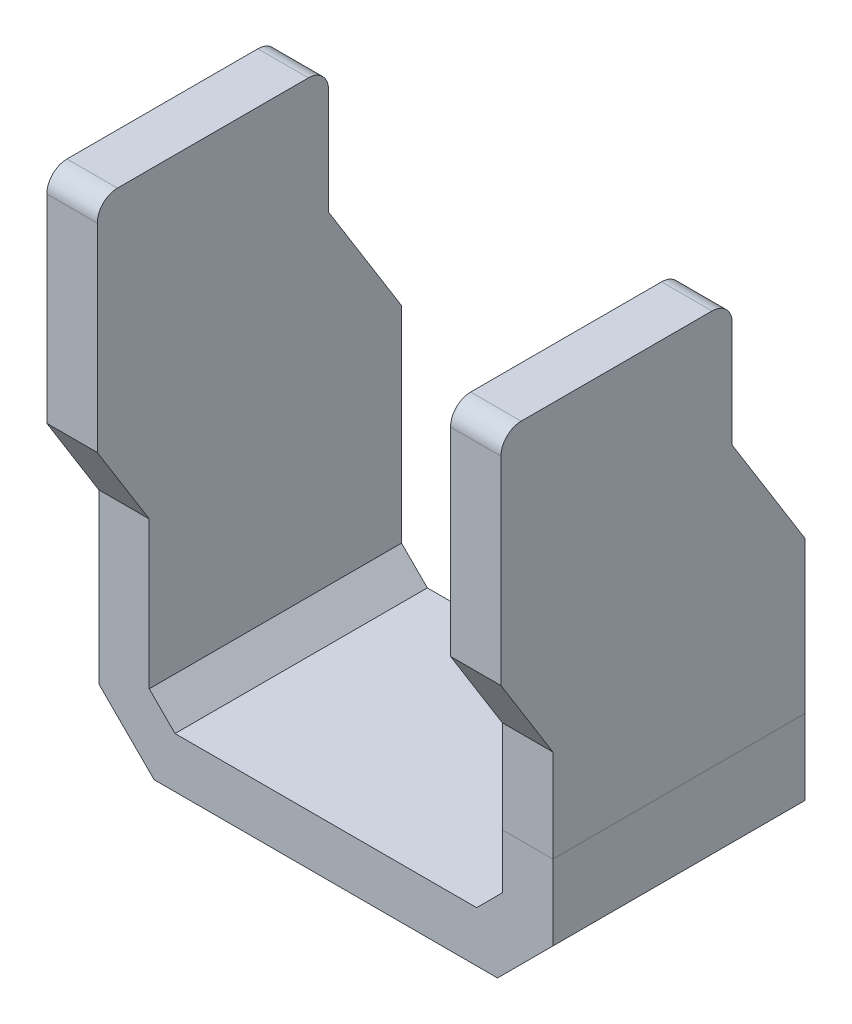
ISO-10303-21;
HEADER;
FILE_DESCRIPTION(('STEP AP214'),'2;1');
FILE_NAME('part.step','',(''),(''),'','','');
FILE_SCHEMA(('AUTOMOTIVE_DESIGN { 1 0 10303 214 1 1 1 1 }'));
ENDSEC;
DATA;
#1=APPLICATION_CONTEXT('core data for automotive mechanical design processes');
#2=APPLICATION_PROTOCOL_DEFINITION('international standard','automotive_design',2000,#1);
#3=PRODUCT_CONTEXT('',#1,'mechanical');
#4=PRODUCT('Part','Part','',(#3));
#5=PRODUCT_RELATED_PRODUCT_CATEGORY('part','',(#4));
#6=PRODUCT_DEFINITION_FORMATION('','',#4);
#7=PRODUCT_DEFINITION_CONTEXT('part definition',#1,'design');
#8=PRODUCT_DEFINITION('design','',#6,#7);
#9=PRODUCT_DEFINITION_SHAPE('','',#8);
#10=(LENGTH_UNIT() NAMED_UNIT(*) SI_UNIT(.MILLI.,.METRE.));
#11=(NAMED_UNIT(*) PLANE_ANGLE_UNIT() SI_UNIT($,.RADIAN.));
#12=(NAMED_UNIT(*) SI_UNIT($,.STERADIAN.) SOLID_ANGLE_UNIT());
#13=UNCERTAINTY_MEASURE_WITH_UNIT(LENGTH_MEASURE(1.E-05),#10,'distance_accuracy_value','');
#14=(GEOMETRIC_REPRESENTATION_CONTEXT(3) GLOBAL_UNCERTAINTY_ASSIGNED_CONTEXT((#13)) GLOBAL_UNIT_ASSIGNED_CONTEXT((#10,
#11,#12)) REPRESENTATION_CONTEXT('',''));
#15=CARTESIAN_POINT('',(0.,0.,0.));
#16=DIRECTION('',(0.,0.,1.));
#17=DIRECTION('',(1.,0.,0.));
#18=AXIS2_PLACEMENT_3D('',#15,#16,#17);
#19=CARTESIAN_POINT('',(-31.9130325338588,17.1366638319386,25.));
#20=DIRECTION('',(0.,0.,1.));
#21=DIRECTION('',(1.,0.,0.));
#22=AXIS2_PLACEMENT_3D('',#19,#20,#21);
#23=PLANE('',#22);
#24=DIRECTION('',(0.,1.,0.));
#25=VECTOR('',#24,1.);
#26=CARTESIAN_POINT('',(17.5,17.1366638319386,25.));
#27=LINE('',#26,#25);
#28=CARTESIAN_POINT('',(17.5,7.94957947348261,25.));
#29=VERTEX_POINT('',#28);
#30=CARTESIAN_POINT('',(17.5,17.1366638319386,25.));
#31=VERTEX_POINT('',#30);
#32=EDGE_CURVE('E59',#29,#31,#27,.T.);
#33=ORIENTED_EDGE('',*,*,#32,.F.);
#34=DIRECTION('',(1.,0.,0.));
#35=VECTOR('',#34,1.);
#36=CARTESIAN_POINT('',(-31.9130325338588,7.9495794734826,25.));
#37=LINE('',#36,#35);
#38=CARTESIAN_POINT('',(22.5,7.94957947348261,25.));
#39=VERTEX_POINT('',#38);
#40=EDGE_CURVE('E123',#29,#39,#37,.T.);
#41=ORIENTED_EDGE('',*,*,#40,.T.);
#42=DIRECTION('',(0.,-1.,0.));
#43=VECTOR('',#42,1.);
#44=CARTESIAN_POINT('',(22.5,17.1366638319386,25.));
#45=LINE('',#44,#43);
#46=CARTESIAN_POINT('',(22.5,17.1366638319386,25.));
#47=VERTEX_POINT('',#46);
#48=EDGE_CURVE('E130',#47,#39,#45,.T.);
#49=ORIENTED_EDGE('',*,*,#48,.F.);
#50=DIRECTION('',(1.,0.,0.));
#51=VECTOR('',#50,1.);
#52=CARTESIAN_POINT('',(-31.9130325338588,17.1366638319386,25.));
#53=LINE('',#52,#51);
#54=EDGE_CURVE('E167',#31,#47,#53,.T.);
#55=ORIENTED_EDGE('',*,*,#54,.F.);
#56=EDGE_LOOP('',(#33,#41,#49,#55));
#57=FACE_BOUND('',#56,.T.);
#58=ADVANCED_FACE('F51',(#57),#23,.T.);
#59=CARTESIAN_POINT('',(-31.9130325338588,25.4161805973599,30.1485773049447));
#60=DIRECTION('',(0.,-0.528071025982883,0.849200206969703));
#61=DIRECTION('',(0.,-0.849200206969703,-0.528071025982883));
#62=AXIS2_PLACEMENT_3D('',#59,#60,#61);
#63=PLANE('',#62);
#64=DIRECTION('',(0.,0.849200206969703,0.528071025982883));
#65=VECTOR('',#64,1.);
#66=CARTESIAN_POINT('',(17.5,25.4161805973599,30.1485773049447));
#67=LINE('',#66,#65);
#68=CARTESIAN_POINT('',(17.5,25.4161805973599,30.1485773049447));
#69=VERTEX_POINT('',#68);
#70=EDGE_CURVE('E224',#31,#69,#67,.T.);
#71=ORIENTED_EDGE('',*,*,#70,.F.);
#72=ORIENTED_EDGE('',*,*,#54,.T.);
#73=DIRECTION('',(0.,-0.849200206969702,-0.528071025982883));
#74=VECTOR('',#73,1.);
#75=CARTESIAN_POINT('',(22.5,25.4161805973599,30.1485773049447));
#76=LINE('',#75,#74);
#77=CARTESIAN_POINT('',(22.5,25.4161805973599,30.1485773049447));
#78=VERTEX_POINT('',#77);
#79=EDGE_CURVE('E135',#78,#47,#76,.T.);
#80=ORIENTED_EDGE('',*,*,#79,.F.);
#81=DIRECTION('',(1.,0.,0.));
#82=VECTOR('',#81,1.);
#83=CARTESIAN_POINT('',(-31.9130325338588,25.4161805973599,30.1485773049447));
#84=LINE('',#83,#82);
#85=EDGE_CURVE('E173',#69,#78,#84,.T.);
#86=ORIENTED_EDGE('',*,*,#85,.F.);
#87=EDGE_LOOP('',(#71,#72,#80,#86));
#88=FACE_BOUND('',#87,.T.);
#89=ADVANCED_FACE('F223',(#88),#63,.T.);
#90=CARTESIAN_POINT('',(-31.9130325338588,45.0994335048831,30.1485773049447));
#91=DIRECTION('',(0.,0.,1.));
#92=DIRECTION('',(1.,0.,0.));
#93=AXIS2_PLACEMENT_3D('',#90,#91,#92);
#94=PLANE('',#93);
#95=DIRECTION('',(0.,1.,0.));
#96=VECTOR('',#95,1.);
#97=CARTESIAN_POINT('',(17.5,45.0994335048831,30.1485773049447));
#98=LINE('',#97,#96);
#99=CARTESIAN_POINT('',(17.5,45.0994335048831,30.1485773049447));
#100=VERTEX_POINT('',#99);
#101=EDGE_CURVE('E216',#69,#100,#98,.T.);
#102=ORIENTED_EDGE('',*,*,#101,.F.);
#103=ORIENTED_EDGE('',*,*,#85,.T.);
#104=DIRECTION('',(0.,-1.,0.));
#105=VECTOR('',#104,1.);
#106=CARTESIAN_POINT('',(22.5,45.0994335048831,30.1485773049447));
#107=LINE('',#106,#105);
#108=CARTESIAN_POINT('',(22.5,45.0994335048831,30.1485773049447));
#109=VERTEX_POINT('',#108);
#110=EDGE_CURVE('E170',#109,#78,#107,.T.);
#111=ORIENTED_EDGE('',*,*,#110,.F.);
#112=DIRECTION('',(1.,0.,0.));
#113=VECTOR('',#112,1.);
#114=CARTESIAN_POINT('',(-31.9130325338588,45.0994335048831,30.1485773049447));
#115=LINE('',#114,#113);
#116=EDGE_CURVE('E174',#100,#109,#115,.T.);
#117=ORIENTED_EDGE('',*,*,#116,.F.);
#118=EDGE_LOOP('',(#102,#103,#111,#117));
#119=FACE_BOUND('',#118,.T.);
#120=ADVANCED_FACE('F217',(#119),#94,.T.);
#121=CARTESIAN_POINT('',(-31.9130325338588,45.0994335048831,28.1485773049447));
#122=DIRECTION('',(1.,0.,0.));
#123=DIRECTION('',(0.,1.,0.));
#124=AXIS2_PLACEMENT_3D('',#121,#122,#123);
#125=CYLINDRICAL_SURFACE('',#124,2.);
#126=CARTESIAN_POINT('',(17.5,45.0994335048831,28.1485773049447));
#127=DIRECTION('',(1.,0.,0.));
#128=DIRECTION('',(0.,0.,-1.));
#129=AXIS2_PLACEMENT_3D('',#126,#127,#128);
#130=CIRCLE('',#129,2.);
#131=CARTESIAN_POINT('',(17.5,47.0994335048831,28.1485773049447));
#132=VERTEX_POINT('',#131);
#133=EDGE_CURVE('E211',#100,#132,#130,.F.);
#134=ORIENTED_EDGE('',*,*,#133,.F.);
#135=ORIENTED_EDGE('',*,*,#116,.T.);
#136=CARTESIAN_POINT('',(22.5,45.0994335048831,28.1485773049447));
#137=DIRECTION('',(1.,0.,0.));
#138=DIRECTION('',(0.,1.,0.));
#139=AXIS2_PLACEMENT_3D('',#136,#137,#138);
#140=CIRCLE('',#139,2.);
#141=CARTESIAN_POINT('',(22.5,47.0994335048831,28.1485773049447));
#142=VERTEX_POINT('',#141);
#143=EDGE_CURVE('E165',#142,#109,#140,.T.);
#144=ORIENTED_EDGE('',*,*,#143,.F.);
#145=DIRECTION('',(1.,0.,0.));
#146=VECTOR('',#145,1.);
#147=CARTESIAN_POINT('',(-31.9130325338588,47.0994335048831,28.1485773049447));
#148=LINE('',#147,#146);
#149=EDGE_CURVE('E180',#132,#142,#148,.T.);
#150=ORIENTED_EDGE('',*,*,#149,.F.);
#151=EDGE_LOOP('',(#134,#135,#144,#150));
#152=FACE_BOUND('',#151,.T.);
#153=ADVANCED_FACE('F212',(#152),#125,.T.);
#154=CARTESIAN_POINT('',(-31.9130325338588,47.0994335048831,9.23077803607524));
#155=DIRECTION('',(0.,1.,0.));
#156=DIRECTION('',(0.,0.,1.));
#157=AXIS2_PLACEMENT_3D('',#154,#155,#156);
#158=PLANE('',#157);
#159=DIRECTION('',(0.,0.,-1.));
#160=VECTOR('',#159,1.);
#161=CARTESIAN_POINT('',(17.5,47.0994335048831,9.23077803607524));
#162=LINE('',#161,#160);
#163=CARTESIAN_POINT('',(17.5,47.0994335048831,9.23077803607524));
#164=VERTEX_POINT('',#163);
#165=EDGE_CURVE('E226',#132,#164,#162,.T.);
#166=ORIENTED_EDGE('',*,*,#165,.F.);
#167=ORIENTED_EDGE('',*,*,#149,.T.);
#168=DIRECTION('',(0.,0.,1.));
#169=VECTOR('',#168,1.);
#170=CARTESIAN_POINT('',(22.5,47.0994335048831,9.23077803607524));
#171=LINE('',#170,#169);
#172=CARTESIAN_POINT('',(22.5,47.0994335048831,9.23077803607524));
#173=VERTEX_POINT('',#172);
#174=EDGE_CURVE('E163',#173,#142,#171,.T.);
#175=ORIENTED_EDGE('',*,*,#174,.F.);
#176=DIRECTION('',(1.,0.,0.));
#177=VECTOR('',#176,1.);
#178=CARTESIAN_POINT('',(-31.9130325338588,47.0994335048831,9.23077803607524));
#179=LINE('',#178,#177);
#180=EDGE_CURVE('E177',#164,#173,#179,.T.);
#181=ORIENTED_EDGE('',*,*,#180,.F.);
#182=EDGE_LOOP('',(#166,#167,#175,#181));
#183=FACE_BOUND('',#182,.T.);
#184=ADVANCED_FACE('F210',(#183),#158,.T.);
#185=CARTESIAN_POINT('',(-31.9130325338588,45.0994335048831,9.23077803607524));
#186=DIRECTION('',(1.,0.,0.));
#187=DIRECTION('',(0.,1.,0.));
#188=AXIS2_PLACEMENT_3D('',#185,#186,#187);
#189=CYLINDRICAL_SURFACE('',#188,2.);
#190=CARTESIAN_POINT('',(17.5,45.0994335048831,9.23077803607524));
#191=DIRECTION('',(1.,0.,0.));
#192=DIRECTION('',(0.,0.,-1.));
#193=AXIS2_PLACEMENT_3D('',#190,#191,#192);
#194=CIRCLE('',#193,2.);
#195=CARTESIAN_POINT('',(17.5,45.0994335048831,7.23077803607524));
#196=VERTEX_POINT('',#195);
#197=EDGE_CURVE('E204',#164,#196,#194,.F.);
#198=ORIENTED_EDGE('',*,*,#197,.F.);
#199=ORIENTED_EDGE('',*,*,#180,.T.);
#200=CARTESIAN_POINT('',(22.5,45.0994335048831,9.23077803607524));
#201=DIRECTION('',(1.,0.,0.));
#202=DIRECTION('',(0.,1.,0.));
#203=AXIS2_PLACEMENT_3D('',#200,#201,#202);
#204=CIRCLE('',#203,2.);
#205=CARTESIAN_POINT('',(22.5,45.0994335048831,7.23077803607524));
#206=VERTEX_POINT('',#205);
#207=EDGE_CURVE('E158',#206,#173,#204,.T.);
#208=ORIENTED_EDGE('',*,*,#207,.F.);
#209=DIRECTION('',(1.,0.,0.));
#210=VECTOR('',#209,1.);
#211=CARTESIAN_POINT('',(-31.9130325338588,45.0994335048831,7.23077803607524));
#212=LINE('',#211,#210);
#213=EDGE_CURVE('E181',#196,#206,#212,.T.);
#214=ORIENTED_EDGE('',*,*,#213,.F.);
#215=EDGE_LOOP('',(#198,#199,#208,#214));
#216=FACE_BOUND('',#215,.T.);
#217=ADVANCED_FACE('F202',(#216),#189,.T.);
#218=CARTESIAN_POINT('',(-31.9130325338588,45.0994335048831,7.23077803607524));
#219=DIRECTION('',(0.,0.,-1.));
#220=DIRECTION('',(-1.,0.,0.));
#221=AXIS2_PLACEMENT_3D('',#218,#219,#220);
#222=PLANE('',#221);
#223=DIRECTION('',(0.,-1.,0.));
#224=VECTOR('',#223,1.);
#225=CARTESIAN_POINT('',(17.5,45.0994335048831,7.23077803607524));
#226=LINE('',#225,#224);
#227=CARTESIAN_POINT('',(17.5,34.5775194714368,7.23077803607525));
#228=VERTEX_POINT('',#227);
#229=EDGE_CURVE('E66',#196,#228,#226,.T.);
#230=ORIENTED_EDGE('',*,*,#229,.F.);
#231=ORIENTED_EDGE('',*,*,#213,.T.);
#232=DIRECTION('',(0.,1.,0.));
#233=VECTOR('',#232,1.);
#234=CARTESIAN_POINT('',(22.5,45.0994335048831,7.23077803607524));
#235=LINE('',#234,#233);
#236=CARTESIAN_POINT('',(22.5,34.5775194714368,7.23077803607524));
#237=VERTEX_POINT('',#236);
#238=EDGE_CURVE('E151',#237,#206,#235,.T.);
#239=ORIENTED_EDGE('',*,*,#238,.F.);
#240=DIRECTION('',(1.,0.,0.));
#241=VECTOR('',#240,1.);
#242=CARTESIAN_POINT('',(-31.9130325338588,34.5775194714368,7.23077803607524));
#243=LINE('',#242,#241);
#244=EDGE_CURVE('E182',#228,#237,#243,.T.);
#245=ORIENTED_EDGE('',*,*,#244,.F.);
#246=EDGE_LOOP('',(#230,#231,#239,#245));
#247=FACE_BOUND('',#246,.T.);
#248=ADVANCED_FACE('F199',(#247),#222,.T.);
#249=CARTESIAN_POINT('',(-31.9130325338588,34.5775194714368,7.23077803607524));
#250=DIRECTION('',(0.,0.528071025982883,-0.849200206969702));
#251=DIRECTION('',(0.,0.849200206969702,0.528071025982883));
#252=AXIS2_PLACEMENT_3D('',#249,#250,#251);
#253=PLANE('',#252);
#254=DIRECTION('',(0.,-0.849200206969702,-0.528071025982883));
#255=VECTOR('',#254,1.);
#256=CARTESIAN_POINT('',(17.5,34.5775194714368,7.23077803607524));
#257=LINE('',#256,#255);
#258=CARTESIAN_POINT('',(17.5,22.9495794734826,0.));
#259=VERTEX_POINT('',#258);
#260=EDGE_CURVE('E61',#228,#259,#257,.T.);
#261=ORIENTED_EDGE('',*,*,#260,.F.);
#262=ORIENTED_EDGE('',*,*,#244,.T.);
#263=DIRECTION('',(0.,0.849200206969702,0.528071025982883));
#264=VECTOR('',#263,1.);
#265=CARTESIAN_POINT('',(22.5,34.5775194714368,7.23077803607524));
#266=LINE('',#265,#264);
#267=CARTESIAN_POINT('',(22.5,22.9495794734826,0.));
#268=VERTEX_POINT('',#267);
#269=EDGE_CURVE('E154',#268,#237,#266,.T.);
#270=ORIENTED_EDGE('',*,*,#269,.F.);
#271=DIRECTION('',(1.,0.,0.));
#272=VECTOR('',#271,1.);
#273=CARTESIAN_POINT('',(-31.9130325338588,22.9495794734826,0.));
#274=LINE('',#273,#272);
#275=EDGE_CURVE('E184',#259,#268,#274,.T.);
#276=ORIENTED_EDGE('',*,*,#275,.F.);
#277=EDGE_LOOP('',(#261,#262,#270,#276));
#278=FACE_BOUND('',#277,.T.);
#279=ADVANCED_FACE('F194',(#278),#253,.T.);
#280=CARTESIAN_POINT('',(-31.9130325338588,7.9495794734826,0.));
#281=DIRECTION('',(0.,0.,-1.));
#282=DIRECTION('',(-1.,0.,0.));
#283=AXIS2_PLACEMENT_3D('',#280,#281,#282);
#284=PLANE('',#283);
#285=DIRECTION('',(0.,-1.,0.));
#286=VECTOR('',#285,1.);
#287=CARTESIAN_POINT('',(17.5,7.9495794734826,0.));
#288=LINE('',#287,#286);
#289=CARTESIAN_POINT('',(17.5,7.94957947348261,0.));
#290=VERTEX_POINT('',#289);
#291=EDGE_CURVE('E175',#259,#290,#288,.T.);
#292=ORIENTED_EDGE('',*,*,#291,.F.);
#293=ORIENTED_EDGE('',*,*,#275,.T.);
#294=DIRECTION('',(0.,1.,0.));
#295=VECTOR('',#294,1.);
#296=CARTESIAN_POINT('',(22.5,7.94957947348261,0.));
#297=LINE('',#296,#295);
#298=CARTESIAN_POINT('',(22.5,7.94957947348261,0.));
#299=VERTEX_POINT('',#298);
#300=EDGE_CURVE('E145',#299,#268,#297,.T.);
#301=ORIENTED_EDGE('',*,*,#300,.F.);
#302=DIRECTION('',(1.,0.,0.));
#303=VECTOR('',#302,1.);
#304=CARTESIAN_POINT('',(-31.9130325338588,7.9495794734826,0.));
#305=LINE('',#304,#303);
#306=EDGE_CURVE('E132',#290,#299,#305,.T.);
#307=ORIENTED_EDGE('',*,*,#306,.F.);
#308=EDGE_LOOP('',(#292,#293,#301,#307));
#309=FACE_BOUND('',#308,.T.);
#310=ADVANCED_FACE('F188',(#309),#284,.T.);
#311=CARTESIAN_POINT('',(-31.9130325338588,7.9495794734826,25.));
#312=DIRECTION('',(0.,-1.,0.));
#313=DIRECTION('',(1.,0.,0.));
#314=AXIS2_PLACEMENT_3D('',#311,#312,#313);
#315=PLANE('',#314);
#316=DIRECTION('',(0.,0.,1.));
#317=VECTOR('',#316,1.);
#318=CARTESIAN_POINT('',(17.5,7.94957947348261,25.));
#319=LINE('',#318,#317);
#320=EDGE_CURVE('E12',#290,#29,#319,.T.);
#321=ORIENTED_EDGE('',*,*,#320,.F.);
#322=ORIENTED_EDGE('',*,*,#306,.T.);
#323=DIRECTION('',(0.,0.,-1.));
#324=VECTOR('',#323,1.);
#325=CARTESIAN_POINT('',(22.5,7.94957947348261,25.));
#326=LINE('',#325,#324);
#327=EDGE_CURVE('E137',#39,#299,#326,.T.);
#328=ORIENTED_EDGE('',*,*,#327,.F.);
#329=ORIENTED_EDGE('',*,*,#40,.F.);
#330=EDGE_LOOP('',(#321,#322,#328,#329));
#331=FACE_BOUND('',#330,.T.);
#332=ADVANCED_FACE('F140',(#331),#315,.T.);
#333=CARTESIAN_POINT('',(22.5,45.0994335048831,9.23077803607524));
#334=DIRECTION('',(1.,0.,0.));
#335=DIRECTION('',(0.,1.,0.));
#336=AXIS2_PLACEMENT_3D('',#333,#334,#335);
#337=PLANE('',#336);
#338=ORIENTED_EDGE('',*,*,#48,.T.);
#339=ORIENTED_EDGE('',*,*,#327,.T.);
#340=ORIENTED_EDGE('',*,*,#300,.T.);
#341=ORIENTED_EDGE('',*,*,#269,.T.);
#342=ORIENTED_EDGE('',*,*,#238,.T.);
#343=ORIENTED_EDGE('',*,*,#207,.T.);
#344=ORIENTED_EDGE('',*,*,#174,.T.);
#345=ORIENTED_EDGE('',*,*,#143,.T.);
#346=ORIENTED_EDGE('',*,*,#110,.T.);
#347=ORIENTED_EDGE('',*,*,#79,.T.);
#348=EDGE_LOOP('',(#338,#339,#340,#341,#342,#343,#344,#345,#346,#347));
#349=FACE_BOUND('',#348,.T.);
#350=ADVANCED_FACE('F144',(#349),#337,.T.);
#351=CARTESIAN_POINT('',(17.5,7.9495794734826,25.));
#352=DIRECTION('',(1.,0.,0.));
#353=DIRECTION('',(0.,0.,-1.));
#354=AXIS2_PLACEMENT_3D('',#351,#352,#353);
#355=PLANE('',#354);
#356=ORIENTED_EDGE('',*,*,#32,.T.);
#357=ORIENTED_EDGE('',*,*,#70,.T.);
#358=ORIENTED_EDGE('',*,*,#101,.T.);
#359=ORIENTED_EDGE('',*,*,#133,.T.);
#360=ORIENTED_EDGE('',*,*,#165,.T.);
#361=ORIENTED_EDGE('',*,*,#197,.T.);
#362=ORIENTED_EDGE('',*,*,#229,.T.);
#363=ORIENTED_EDGE('',*,*,#260,.T.);
#364=ORIENTED_EDGE('',*,*,#291,.T.);
#365=ORIENTED_EDGE('',*,*,#320,.T.);
#366=EDGE_LOOP('',(#356,#357,#358,#359,#360,#361,#362,#363,#364,#365));
#367=FACE_BOUND('',#366,.T.);
#368=ADVANCED_FACE('F231',(#367),#355,.F.);
#369=CLOSED_SHELL('',(#58,#89,#120,#153,#184,#217,#248,#279,#310,#332,#350,#368));
#370=MANIFOLD_SOLID_BREP('B2',#369);
#371=CARTESIAN_POINT('',(-22.5,7.9495794734826,25.));
#372=DIRECTION('',(1.,0.,0.));
#373=DIRECTION('',(0.,0.,-1.));
#374=AXIS2_PLACEMENT_3D('',#371,#372,#373);
#375=PLANE('',#374);
#376=DIRECTION('',(0.,-1.,0.));
#377=VECTOR('',#376,1.);
#378=CARTESIAN_POINT('',(-22.5,7.9495794734826,0.));
#379=LINE('',#378,#377);
#380=CARTESIAN_POINT('',(-22.5,22.9495794734826,0.));
#381=VERTEX_POINT('',#380);
#382=CARTESIAN_POINT('',(-22.5,0.488226466973244,0.));
#383=VERTEX_POINT('',#382);
#384=EDGE_CURVE('E444',#381,#383,#379,.T.);
#385=ORIENTED_EDGE('',*,*,#384,.T.);
#386=DIRECTION('',(0.,0.,-1.));
#387=VECTOR('',#386,1.);
#388=CARTESIAN_POINT('',(-22.5,0.488226466973244,25.));
#389=LINE('',#388,#387);
#390=CARTESIAN_POINT('',(-22.5,0.488226466973244,25.));
#391=VERTEX_POINT('',#390);
#392=EDGE_CURVE('E47',#391,#383,#389,.T.);
#393=ORIENTED_EDGE('',*,*,#392,.F.);
#394=DIRECTION('',(0.,-1.,0.));
#395=VECTOR('',#394,1.);
#396=CARTESIAN_POINT('',(-22.5,7.9495794734826,25.));
#397=LINE('',#396,#395);
#398=CARTESIAN_POINT('',(-22.5,17.1366638319386,25.));
#399=VERTEX_POINT('',#398);
#400=EDGE_CURVE('E397',#399,#391,#397,.T.);
#401=ORIENTED_EDGE('',*,*,#400,.F.);
#402=DIRECTION('',(0.,-0.849200206969702,-0.528071025982883));
#403=VECTOR('',#402,1.);
#404=CARTESIAN_POINT('',(-22.5,25.4161805973599,30.1485773049447));
#405=LINE('',#404,#403);
#406=CARTESIAN_POINT('',(-22.5,25.4161805973599,30.1485773049447));
#407=VERTEX_POINT('',#406);
#408=EDGE_CURVE('E580',#407,#399,#405,.T.);
#409=ORIENTED_EDGE('',*,*,#408,.F.);
#410=DIRECTION('',(0.,-1.,0.));
#411=VECTOR('',#410,1.);
#412=CARTESIAN_POINT('',(-22.5,45.0994335048831,30.1485773049447));
#413=LINE('',#412,#411);
#414=CARTESIAN_POINT('',(-22.5,45.0994335048831,30.1485773049447));
#415=VERTEX_POINT('',#414);
#416=EDGE_CURVE('E568',#415,#407,#413,.T.);
#417=ORIENTED_EDGE('',*,*,#416,.F.);
#418=CARTESIAN_POINT('',(-22.5,45.0994335048831,28.1485773049447));
#419=DIRECTION('',(1.,0.,0.));
#420=DIRECTION('',(0.,1.,0.));
#421=AXIS2_PLACEMENT_3D('',#418,#419,#420);
#422=CIRCLE('',#421,2.);
#423=CARTESIAN_POINT('',(-22.5,47.0994335048831,28.1485773049447));
#424=VERTEX_POINT('',#423);
#425=EDGE_CURVE('E559',#424,#415,#422,.T.);
#426=ORIENTED_EDGE('',*,*,#425,.F.);
#427=DIRECTION('',(0.,0.,1.));
#428=VECTOR('',#427,1.);
#429=CARTESIAN_POINT('',(-22.5,47.0994335048831,9.23077803607524));
#430=LINE('',#429,#428);
#431=CARTESIAN_POINT('',(-22.5,47.0994335048831,9.23077803607524));
#432=VERTEX_POINT('',#431);
#433=EDGE_CURVE('E546',#432,#424,#430,.T.);
#434=ORIENTED_EDGE('',*,*,#433,.F.);
#435=CARTESIAN_POINT('',(-22.5,45.0994335048831,9.23077803607524));
#436=DIRECTION('',(1.,0.,0.));
#437=DIRECTION('',(0.,1.,0.));
#438=AXIS2_PLACEMENT_3D('',#435,#436,#437);
#439=CIRCLE('',#438,2.);
#440=CARTESIAN_POINT('',(-22.5,45.0994335048831,7.23077803607524));
#441=VERTEX_POINT('',#440);
#442=EDGE_CURVE('E543',#441,#432,#439,.T.);
#443=ORIENTED_EDGE('',*,*,#442,.F.);
#444=DIRECTION('',(0.,1.,0.));
#445=VECTOR('',#444,1.);
#446=CARTESIAN_POINT('',(-22.5,45.0994335048831,7.23077803607524));
#447=LINE('',#446,#445);
#448=CARTESIAN_POINT('',(-22.5,34.5775194714368,7.23077803607524));
#449=VERTEX_POINT('',#448);
#450=EDGE_CURVE('E535',#449,#441,#447,.T.);
#451=ORIENTED_EDGE('',*,*,#450,.F.);
#452=DIRECTION('',(0.,0.849200206969702,0.528071025982883));
#453=VECTOR('',#452,1.);
#454=CARTESIAN_POINT('',(-22.5,34.5775194714368,7.23077803607524));
#455=LINE('',#454,#453);
#456=EDGE_CURVE('E522',#381,#449,#455,.T.);
#457=ORIENTED_EDGE('',*,*,#456,.F.);
#458=EDGE_LOOP('',(#385,#393,#401,#409,#417,#426,#434,#443,#451,#457));
#459=FACE_BOUND('',#458,.T.);
#460=ADVANCED_FACE('F332',(#459),#375,.F.);
#461=CARTESIAN_POINT('',(-22.5,0.488226466973244,25.));
#462=DIRECTION('',(0.707106781186549,0.707106781186546,0.));
#463=DIRECTION('',(-0.707106781186546,0.707106781186549,0.));
#464=AXIS2_PLACEMENT_3D('',#461,#462,#463);
#465=PLANE('',#464);
#466=DIRECTION('',(0.707106781186546,-0.707106781186549,0.));
#467=VECTOR('',#466,1.);
#468=CARTESIAN_POINT('',(-22.5,0.488226466973244,0.));
#469=LINE('',#468,#467);
#470=CARTESIAN_POINT('',(-17.0117735330268,-5.,0.));
#471=VERTEX_POINT('',#470);
#472=EDGE_CURVE('E450',#383,#471,#469,.T.);
#473=ORIENTED_EDGE('',*,*,#472,.T.);
#474=DIRECTION('',(0.,0.,-1.));
#475=VECTOR('',#474,1.);
#476=CARTESIAN_POINT('',(-17.0117735330268,-5.,25.));
#477=LINE('',#476,#475);
#478=CARTESIAN_POINT('',(-17.0117735330268,-5.,25.));
#479=VERTEX_POINT('',#478);
#480=EDGE_CURVE('E339',#479,#471,#477,.T.);
#481=ORIENTED_EDGE('',*,*,#480,.F.);
#482=DIRECTION('',(0.707106781186546,-0.707106781186549,0.));
#483=VECTOR('',#482,1.);
#484=CARTESIAN_POINT('',(-22.5,0.488226466973244,25.));
#485=LINE('',#484,#483);
#486=EDGE_CURVE('E493',#391,#479,#485,.T.);
#487=ORIENTED_EDGE('',*,*,#486,.F.);
#488=ORIENTED_EDGE('',*,*,#392,.T.);
#489=EDGE_LOOP('',(#473,#481,#487,#488));
#490=FACE_BOUND('',#489,.T.);
#491=ADVANCED_FACE('F489',(#490),#465,.F.);
#492=CARTESIAN_POINT('',(17.0117735330268,-4.99999999999999,25.));
#493=DIRECTION('',(0.,1.,0.));
#494=DIRECTION('',(-1.,0.,0.));
#495=AXIS2_PLACEMENT_3D('',#492,#493,#494);
#496=PLANE('',#495);
#497=DIRECTION('',(1.,0.,0.));
#498=VECTOR('',#497,1.);
#499=CARTESIAN_POINT('',(17.0117735330268,-4.99999999999999,0.));
#500=LINE('',#499,#498);
#501=CARTESIAN_POINT('',(17.0117735330268,-4.99999999999999,0.));
#502=VERTEX_POINT('',#501);
#503=EDGE_CURVE('E453',#471,#502,#500,.T.);
#504=ORIENTED_EDGE('',*,*,#503,.T.);
#505=DIRECTION('',(0.,0.,-1.));
#506=VECTOR('',#505,1.);
#507=CARTESIAN_POINT('',(17.0117735330268,-4.99999999999999,25.));
#508=LINE('',#507,#506);
#509=CARTESIAN_POINT('',(17.0117735330268,-4.99999999999999,25.));
#510=VERTEX_POINT('',#509);
#511=EDGE_CURVE('E480',#510,#502,#508,.T.);
#512=ORIENTED_EDGE('',*,*,#511,.F.);
#513=DIRECTION('',(1.,0.,0.));
#514=VECTOR('',#513,1.);
#515=CARTESIAN_POINT('',(-17.0117735330268,-5.,25.));
#516=LINE('',#515,#514);
#517=EDGE_CURVE('E487',#479,#510,#516,.T.);
#518=ORIENTED_EDGE('',*,*,#517,.F.);
#519=ORIENTED_EDGE('',*,*,#480,.T.);
#520=EDGE_LOOP('',(#504,#512,#518,#519));
#521=FACE_BOUND('',#520,.T.);
#522=ADVANCED_FACE('F481',(#521),#496,.F.);
#523=CARTESIAN_POINT('',(22.5,0.488226466973248,25.));
#524=DIRECTION('',(-0.707106781186549,0.707106781186546,0.));
#525=DIRECTION('',(-0.707106781186546,-0.707106781186549,0.));
#526=AXIS2_PLACEMENT_3D('',#523,#524,#525);
#527=PLANE('',#526);
#528=DIRECTION('',(0.707106781186546,0.707106781186549,0.));
#529=VECTOR('',#528,1.);
#530=CARTESIAN_POINT('',(22.5,0.488226466973248,0.));
#531=LINE('',#530,#529);
#532=CARTESIAN_POINT('',(22.5,0.488226466973248,0.));
#533=VERTEX_POINT('',#532);
#534=EDGE_CURVE('E452',#502,#533,#531,.T.);
#535=ORIENTED_EDGE('',*,*,#534,.T.);
#536=DIRECTION('',(0.,0.,-1.));
#537=VECTOR('',#536,1.);
#538=CARTESIAN_POINT('',(22.5,0.488226466973248,25.));
#539=LINE('',#538,#537);
#540=CARTESIAN_POINT('',(22.5,0.488226466973248,25.));
#541=VERTEX_POINT('',#540);
#542=EDGE_CURVE('E478',#541,#533,#539,.T.);
#543=ORIENTED_EDGE('',*,*,#542,.F.);
#544=DIRECTION('',(0.707106781186546,0.707106781186549,0.));
#545=VECTOR('',#544,1.);
#546=CARTESIAN_POINT('',(22.5,0.488226466973248,25.));
#547=LINE('',#546,#545);
#548=EDGE_CURVE('E514',#510,#541,#547,.T.);
#549=ORIENTED_EDGE('',*,*,#548,.F.);
#550=ORIENTED_EDGE('',*,*,#511,.T.);
#551=EDGE_LOOP('',(#535,#543,#549,#550));
#552=FACE_BOUND('',#551,.T.);
#553=ADVANCED_FACE('F502',(#552),#527,.F.);
#554=CARTESIAN_POINT('',(22.5,7.9495794734826,25.));
#555=DIRECTION('',(-1.,0.,0.));
#556=DIRECTION('',(0.,0.,1.));
#557=AXIS2_PLACEMENT_3D('',#554,#555,#556);
#558=PLANE('',#557);
#559=DIRECTION('',(0.,1.,0.));
#560=VECTOR('',#559,1.);
#561=CARTESIAN_POINT('',(22.5,7.9495794734826,0.));
#562=LINE('',#561,#560);
#563=CARTESIAN_POINT('',(22.5,7.9495794734826,0.));
#564=VERTEX_POINT('',#563);
#565=EDGE_CURVE('E451',#533,#564,#562,.T.);
#566=ORIENTED_EDGE('',*,*,#565,.T.);
#567=DIRECTION('',(0.,0.,-1.));
#568=VECTOR('',#567,1.);
#569=CARTESIAN_POINT('',(22.5,7.9495794734826,25.));
#570=LINE('',#569,#568);
#571=CARTESIAN_POINT('',(22.5,7.9495794734826,25.));
#572=VERTEX_POINT('',#571);
#573=EDGE_CURVE('E472',#572,#564,#570,.T.);
#574=ORIENTED_EDGE('',*,*,#573,.F.);
#575=DIRECTION('',(0.,1.,0.));
#576=VECTOR('',#575,1.);
#577=CARTESIAN_POINT('',(22.5,7.9495794734826,25.));
#578=LINE('',#577,#576);
#579=EDGE_CURVE('E509',#541,#572,#578,.T.);
#580=ORIENTED_EDGE('',*,*,#579,.F.);
#581=ORIENTED_EDGE('',*,*,#542,.T.);
#582=EDGE_LOOP('',(#566,#574,#580,#581));
#583=FACE_BOUND('',#582,.T.);
#584=ADVANCED_FACE('F507',(#583),#558,.F.);
#585=CARTESIAN_POINT('',(22.5,7.9495794734826,25.));
#586=DIRECTION('',(0.,-1.,0.));
#587=DIRECTION('',(1.,0.,0.));
#588=AXIS2_PLACEMENT_3D('',#585,#586,#587);
#589=PLANE('',#588);
#590=DIRECTION('',(-1.,0.,0.));
#591=VECTOR('',#590,1.);
#592=CARTESIAN_POINT('',(22.5,7.9495794734826,0.));
#593=LINE('',#592,#591);
#594=CARTESIAN_POINT('',(17.5,7.9495794734826,0.));
#595=VERTEX_POINT('',#594);
#596=EDGE_CURVE('E459',#564,#595,#593,.T.);
#597=ORIENTED_EDGE('',*,*,#596,.T.);
#598=DIRECTION('',(0.,0.,-1.));
#599=VECTOR('',#598,1.);
#600=CARTESIAN_POINT('',(17.5,7.9495794734826,25.));
#601=LINE('',#600,#599);
#602=CARTESIAN_POINT('',(17.5,7.9495794734826,25.));
#603=VERTEX_POINT('',#602);
#604=EDGE_CURVE('E468',#603,#595,#601,.T.);
#605=ORIENTED_EDGE('',*,*,#604,.F.);
#606=DIRECTION('',(-1.,0.,0.));
#607=VECTOR('',#606,1.);
#608=CARTESIAN_POINT('',(22.5,7.9495794734826,25.));
#609=LINE('',#608,#607);
#610=EDGE_CURVE('E515',#572,#603,#609,.T.);
#611=ORIENTED_EDGE('',*,*,#610,.F.);
#612=ORIENTED_EDGE('',*,*,#573,.T.);
#613=EDGE_LOOP('',(#597,#605,#611,#612));
#614=FACE_BOUND('',#613,.T.);
#615=ADVANCED_FACE('F668',(#614),#589,.F.);
#616=CARTESIAN_POINT('',(17.5,7.9495794734826,25.));
#617=DIRECTION('',(1.,0.,0.));
#618=DIRECTION('',(0.,0.,-1.));
#619=AXIS2_PLACEMENT_3D('',#616,#617,#618);
#620=PLANE('',#619);
#621=DIRECTION('',(0.,-1.,0.));
#622=VECTOR('',#621,1.);
#623=CARTESIAN_POINT('',(17.5,7.9495794734826,0.));
#624=LINE('',#623,#622);
#625=CARTESIAN_POINT('',(17.5,2.55929427883872,0.));
#626=VERTEX_POINT('',#625);
#627=EDGE_CURVE('E460',#595,#626,#624,.T.);
#628=ORIENTED_EDGE('',*,*,#627,.T.);
#629=DIRECTION('',(0.,0.,-1.));
#630=VECTOR('',#629,1.);
#631=CARTESIAN_POINT('',(17.5,2.55929427883872,25.));
#632=LINE('',#631,#630);
#633=CARTESIAN_POINT('',(17.5,2.55929427883872,25.));
#634=VERTEX_POINT('',#633);
#635=EDGE_CURVE('E432',#634,#626,#632,.T.);
#636=ORIENTED_EDGE('',*,*,#635,.F.);
#637=DIRECTION('',(0.,-1.,0.));
#638=VECTOR('',#637,1.);
#639=CARTESIAN_POINT('',(17.5,7.9495794734826,25.));
#640=LINE('',#639,#638);
#641=EDGE_CURVE('E425',#603,#634,#640,.T.);
#642=ORIENTED_EDGE('',*,*,#641,.F.);
#643=ORIENTED_EDGE('',*,*,#604,.T.);
#644=EDGE_LOOP('',(#628,#636,#642,#643));
#645=FACE_BOUND('',#644,.T.);
#646=ADVANCED_FACE('F670',(#645),#620,.F.);
#647=CARTESIAN_POINT('',(17.5,2.55929427883872,25.));
#648=DIRECTION('',(0.707106781186549,-0.707106781186546,0.));
#649=DIRECTION('',(0.707106781186546,0.707106781186549,0.));
#650=AXIS2_PLACEMENT_3D('',#647,#648,#649);
#651=PLANE('',#650);
#652=DIRECTION('',(-0.707106781186546,-0.707106781186549,0.));
#653=VECTOR('',#652,1.);
#654=CARTESIAN_POINT('',(17.5,2.55929427883872,0.));
#655=LINE('',#654,#653);
#656=CARTESIAN_POINT('',(14.9407057211613,0.,0.));
#657=VERTEX_POINT('',#656);
#658=EDGE_CURVE('E433',#626,#657,#655,.T.);
#659=ORIENTED_EDGE('',*,*,#658,.T.);
#660=DIRECTION('',(0.,0.,-1.));
#661=VECTOR('',#660,1.);
#662=CARTESIAN_POINT('',(14.9407057211613,0.,25.));
#663=LINE('',#662,#661);
#664=CARTESIAN_POINT('',(14.9407057211613,0.,25.));
#665=VERTEX_POINT('',#664);
#666=EDGE_CURVE('E427',#665,#657,#663,.T.);
#667=ORIENTED_EDGE('',*,*,#666,.F.);
#668=DIRECTION('',(-0.707106781186546,-0.707106781186549,0.));
#669=VECTOR('',#668,1.);
#670=CARTESIAN_POINT('',(17.5,2.55929427883872,25.));
#671=LINE('',#670,#669);
#672=EDGE_CURVE('E418',#634,#665,#671,.T.);
#673=ORIENTED_EDGE('',*,*,#672,.F.);
#674=ORIENTED_EDGE('',*,*,#635,.T.);
#675=EDGE_LOOP('',(#659,#667,#673,#674));
#676=FACE_BOUND('',#675,.T.);
#677=ADVANCED_FACE('F431',(#676),#651,.F.);
#678=CARTESIAN_POINT('',(-14.9407057211613,0.,25.));
#679=DIRECTION('',(0.,-1.,0.));
#680=DIRECTION('',(0.,0.,-1.));
#681=AXIS2_PLACEMENT_3D('',#678,#679,#680);
#682=PLANE('',#681);
#683=DIRECTION('',(-1.,0.,0.));
#684=VECTOR('',#683,1.);
#685=CARTESIAN_POINT('',(-14.9407057211613,0.,0.));
#686=LINE('',#685,#684);
#687=CARTESIAN_POINT('',(-14.9407057211613,0.,0.));
#688=VERTEX_POINT('',#687);
#689=EDGE_CURVE('E385',#657,#688,#686,.T.);
#690=ORIENTED_EDGE('',*,*,#689,.T.);
#691=DIRECTION('',(0.,0.,-1.));
#692=VECTOR('',#691,1.);
#693=CARTESIAN_POINT('',(-14.9407057211613,0.,25.));
#694=LINE('',#693,#692);
#695=CARTESIAN_POINT('',(-14.9407057211613,0.,25.));
#696=VERTEX_POINT('',#695);
#697=EDGE_CURVE('E434',#696,#688,#694,.T.);
#698=ORIENTED_EDGE('',*,*,#697,.F.);
#699=DIRECTION('',(-1.,0.,0.));
#700=VECTOR('',#699,1.);
#701=CARTESIAN_POINT('',(14.9407057211613,0.,25.));
#702=LINE('',#701,#700);
#703=EDGE_CURVE('E422',#665,#696,#702,.T.);
#704=ORIENTED_EDGE('',*,*,#703,.F.);
#705=ORIENTED_EDGE('',*,*,#666,.T.);
#706=EDGE_LOOP('',(#690,#698,#704,#705));
#707=FACE_BOUND('',#706,.T.);
#708=ADVANCED_FACE('F440',(#707),#682,.F.);
#709=CARTESIAN_POINT('',(-17.5,2.55929427883871,25.));
#710=DIRECTION('',(-0.707106781186549,-0.707106781186546,0.));
#711=DIRECTION('',(0.707106781186546,-0.707106781186549,0.));
#712=AXIS2_PLACEMENT_3D('',#709,#710,#711);
#713=PLANE('',#712);
#714=DIRECTION('',(-0.707106781186547,0.707106781186549,0.));
#715=VECTOR('',#714,1.);
#716=CARTESIAN_POINT('',(-17.5,2.55929427883871,0.));
#717=LINE('',#716,#715);
#718=CARTESIAN_POINT('',(-17.5,2.55929427883871,0.));
#719=VERTEX_POINT('',#718);
#720=EDGE_CURVE('E387',#688,#719,#717,.T.);
#721=ORIENTED_EDGE('',*,*,#720,.T.);
#722=DIRECTION('',(0.,0.,-1.));
#723=VECTOR('',#722,1.);
#724=CARTESIAN_POINT('',(-17.5,2.55929427883871,25.));
#725=LINE('',#724,#723);
#726=CARTESIAN_POINT('',(-17.5,2.55929427883871,25.));
#727=VERTEX_POINT('',#726);
#728=EDGE_CURVE('E443',#727,#719,#725,.T.);
#729=ORIENTED_EDGE('',*,*,#728,.F.);
#730=DIRECTION('',(-0.707106781186547,0.707106781186549,0.));
#731=VECTOR('',#730,1.);
#732=CARTESIAN_POINT('',(-17.5,2.55929427883871,25.));
#733=LINE('',#732,#731);
#734=EDGE_CURVE('E349',#696,#727,#733,.T.);
#735=ORIENTED_EDGE('',*,*,#734,.F.);
#736=ORIENTED_EDGE('',*,*,#697,.T.);
#737=EDGE_LOOP('',(#721,#729,#735,#736));
#738=FACE_BOUND('',#737,.T.);
#739=ADVANCED_FACE('F678',(#738),#713,.F.);
#740=CARTESIAN_POINT('',(-17.5,7.9495794734826,25.));
#741=DIRECTION('',(-1.,0.,0.));
#742=DIRECTION('',(0.,0.,1.));
#743=AXIS2_PLACEMENT_3D('',#740,#741,#742);
#744=PLANE('',#743);
#745=DIRECTION('',(0.,1.,0.));
#746=VECTOR('',#745,1.);
#747=CARTESIAN_POINT('',(-17.5,7.9495794734826,0.));
#748=LINE('',#747,#746);
#749=CARTESIAN_POINT('',(-17.5,22.9495794734826,0.));
#750=VERTEX_POINT('',#749);
#751=EDGE_CURVE('E464',#719,#750,#748,.T.);
#752=ORIENTED_EDGE('',*,*,#751,.T.);
#753=DIRECTION('',(0.,-0.849200206969702,-0.528071025982883));
#754=VECTOR('',#753,1.);
#755=CARTESIAN_POINT('',(-17.5,34.5775194714368,7.23077803607524));
#756=LINE('',#755,#754);
#757=CARTESIAN_POINT('',(-17.5,34.5775194714368,7.23077803607525));
#758=VERTEX_POINT('',#757);
#759=EDGE_CURVE('E527',#758,#750,#756,.T.);
#760=ORIENTED_EDGE('',*,*,#759,.F.);
#761=DIRECTION('',(0.,-1.,0.));
#762=VECTOR('',#761,1.);
#763=CARTESIAN_POINT('',(-17.5,45.0994335048831,7.23077803607524));
#764=LINE('',#763,#762);
#765=CARTESIAN_POINT('',(-17.5,45.0994335048831,7.23077803607524));
#766=VERTEX_POINT('',#765);
#767=EDGE_CURVE('E533',#766,#758,#764,.T.);
#768=ORIENTED_EDGE('',*,*,#767,.F.);
#769=CARTESIAN_POINT('',(-17.5,45.0994335048831,9.23077803607524));
#770=DIRECTION('',(1.,0.,0.));
#771=DIRECTION('',(0.,0.,-1.));
#772=AXIS2_PLACEMENT_3D('',#769,#770,#771);
#773=CIRCLE('',#772,2.);
#774=CARTESIAN_POINT('',(-17.5,47.0994335048831,9.23077803607524));
#775=VERTEX_POINT('',#774);
#776=EDGE_CURVE('E545',#775,#766,#773,.F.);
#777=ORIENTED_EDGE('',*,*,#776,.F.);
#778=DIRECTION('',(0.,0.,-1.));
#779=VECTOR('',#778,1.);
#780=CARTESIAN_POINT('',(-17.5,47.0994335048831,9.23077803607524));
#781=LINE('',#780,#779);
#782=CARTESIAN_POINT('',(-17.5,47.0994335048831,28.1485773049447));
#783=VERTEX_POINT('',#782);
#784=EDGE_CURVE('E551',#783,#775,#781,.T.);
#785=ORIENTED_EDGE('',*,*,#784,.F.);
#786=CARTESIAN_POINT('',(-17.5,45.0994335048831,28.1485773049447));
#787=DIRECTION('',(1.,0.,0.));
#788=DIRECTION('',(0.,0.,-1.));
#789=AXIS2_PLACEMENT_3D('',#786,#787,#788);
#790=CIRCLE('',#789,2.);
#791=CARTESIAN_POINT('',(-17.5,45.0994335048831,30.1485773049447));
#792=VERTEX_POINT('',#791);
#793=EDGE_CURVE('E565',#792,#783,#790,.F.);
#794=ORIENTED_EDGE('',*,*,#793,.F.);
#795=DIRECTION('',(0.,1.,0.));
#796=VECTOR('',#795,1.);
#797=CARTESIAN_POINT('',(-17.5,45.0994335048831,30.1485773049447));
#798=LINE('',#797,#796);
#799=CARTESIAN_POINT('',(-17.5,25.4161805973599,30.1485773049447));
#800=VERTEX_POINT('',#799);
#801=EDGE_CURVE('E571',#800,#792,#798,.T.);
#802=ORIENTED_EDGE('',*,*,#801,.F.);
#803=DIRECTION('',(0.,0.849200206969703,0.528071025982883));
#804=VECTOR('',#803,1.);
#805=CARTESIAN_POINT('',(-17.5,25.4161805973599,30.1485773049447));
#806=LINE('',#805,#804);
#807=CARTESIAN_POINT('',(-17.5,17.1366638319386,25.));
#808=VERTEX_POINT('',#807);
#809=EDGE_CURVE('E578',#808,#800,#806,.T.);
#810=ORIENTED_EDGE('',*,*,#809,.F.);
#811=DIRECTION('',(0.,1.,0.));
#812=VECTOR('',#811,1.);
#813=CARTESIAN_POINT('',(-17.5,7.9495794734826,25.));
#814=LINE('',#813,#812);
#815=EDGE_CURVE('E437',#727,#808,#814,.T.);
#816=ORIENTED_EDGE('',*,*,#815,.F.);
#817=ORIENTED_EDGE('',*,*,#728,.T.);
#818=EDGE_LOOP('',(#752,#760,#768,#777,#785,#794,#802,#810,#816,#817));
#819=FACE_BOUND('',#818,.T.);
#820=ADVANCED_FACE('F626',(#819),#744,.F.);
#821=CARTESIAN_POINT('',(0.,0.,25.));
#822=DIRECTION('',(0.,0.,-1.));
#823=DIRECTION('',(-1.,0.,0.));
#824=AXIS2_PLACEMENT_3D('',#821,#822,#823);
#825=PLANE('',#824);
#826=ORIENTED_EDGE('',*,*,#815,.T.);
#827=DIRECTION('',(-1.,0.,0.));
#828=VECTOR('',#827,1.);
#829=CARTESIAN_POINT('',(31.9130325338588,17.1366638319386,25.));
#830=LINE('',#829,#828);
#831=EDGE_CURVE('E582',#808,#399,#830,.T.);
#832=ORIENTED_EDGE('',*,*,#831,.T.);
#833=ORIENTED_EDGE('',*,*,#400,.T.);
#834=ORIENTED_EDGE('',*,*,#486,.T.);
#835=ORIENTED_EDGE('',*,*,#517,.T.);
#836=ORIENTED_EDGE('',*,*,#548,.T.);
#837=ORIENTED_EDGE('',*,*,#579,.T.);
#838=ORIENTED_EDGE('',*,*,#610,.T.);
#839=ORIENTED_EDGE('',*,*,#641,.T.);
#840=ORIENTED_EDGE('',*,*,#672,.T.);
#841=ORIENTED_EDGE('',*,*,#703,.T.);
#842=ORIENTED_EDGE('',*,*,#734,.T.);
#843=EDGE_LOOP('',(#826,#832,#833,#834,#835,#836,#837,#838,#839,#840,#841,#842));
#844=FACE_BOUND('',#843,.T.);
#845=ADVANCED_FACE('F416',(#844),#825,.F.);
#846=CARTESIAN_POINT('',(0.,0.,0.));
#847=DIRECTION('',(0.,0.,-1.));
#848=DIRECTION('',(-1.,0.,0.));
#849=AXIS2_PLACEMENT_3D('',#846,#847,#848);
#850=PLANE('',#849);
#851=ORIENTED_EDGE('',*,*,#384,.F.);
#852=DIRECTION('',(-1.,0.,0.));
#853=VECTOR('',#852,1.);
#854=CARTESIAN_POINT('',(31.9130325338588,22.9495794734826,0.));
#855=LINE('',#854,#853);
#856=EDGE_CURVE('E449',#750,#381,#855,.T.);
#857=ORIENTED_EDGE('',*,*,#856,.F.);
#858=ORIENTED_EDGE('',*,*,#751,.F.);
#859=ORIENTED_EDGE('',*,*,#720,.F.);
#860=ORIENTED_EDGE('',*,*,#689,.F.);
#861=ORIENTED_EDGE('',*,*,#658,.F.);
#862=ORIENTED_EDGE('',*,*,#627,.F.);
#863=ORIENTED_EDGE('',*,*,#596,.F.);
#864=ORIENTED_EDGE('',*,*,#565,.F.);
#865=ORIENTED_EDGE('',*,*,#534,.F.);
#866=ORIENTED_EDGE('',*,*,#503,.F.);
#867=ORIENTED_EDGE('',*,*,#472,.F.);
#868=EDGE_LOOP('',(#851,#857,#858,#859,#860,#861,#862,#863,#864,#865,#866,#867));
#869=FACE_BOUND('',#868,.T.);
#870=ADVANCED_FACE('F492',(#869),#850,.T.);
#871=CARTESIAN_POINT('',(31.9130325338588,25.4161805973599,30.1485773049447));
#872=DIRECTION('',(0.,-0.528071025982883,0.849200206969703));
#873=DIRECTION('',(0.,-0.849200206969703,-0.528071025982883));
#874=AXIS2_PLACEMENT_3D('',#871,#872,#873);
#875=PLANE('',#874);
#876=ORIENTED_EDGE('',*,*,#809,.T.);
#877=DIRECTION('',(-1.,0.,0.));
#878=VECTOR('',#877,1.);
#879=CARTESIAN_POINT('',(31.9130325338588,25.4161805973599,30.1485773049447));
#880=LINE('',#879,#878);
#881=EDGE_CURVE('E573',#800,#407,#880,.T.);
#882=ORIENTED_EDGE('',*,*,#881,.T.);
#883=ORIENTED_EDGE('',*,*,#408,.T.);
#884=ORIENTED_EDGE('',*,*,#831,.F.);
#885=EDGE_LOOP('',(#876,#882,#883,#884));
#886=FACE_BOUND('',#885,.T.);
#887=ADVANCED_FACE('F592',(#886),#875,.T.);
#888=CARTESIAN_POINT('',(31.9130325338588,45.0994335048831,30.1485773049447));
#889=DIRECTION('',(0.,0.,1.));
#890=DIRECTION('',(-1.,0.,0.));
#891=AXIS2_PLACEMENT_3D('',#888,#889,#890);
#892=PLANE('',#891);
#893=ORIENTED_EDGE('',*,*,#801,.T.);
#894=DIRECTION('',(-1.,0.,0.));
#895=VECTOR('',#894,1.);
#896=CARTESIAN_POINT('',(31.9130325338588,45.0994335048831,30.1485773049447));
#897=LINE('',#896,#895);
#898=EDGE_CURVE('E564',#792,#415,#897,.T.);
#899=ORIENTED_EDGE('',*,*,#898,.T.);
#900=ORIENTED_EDGE('',*,*,#416,.T.);
#901=ORIENTED_EDGE('',*,*,#881,.F.);
#902=EDGE_LOOP('',(#893,#899,#900,#901));
#903=FACE_BOUND('',#902,.T.);
#904=ADVANCED_FACE('F647',(#903),#892,.T.);
#905=CARTESIAN_POINT('',(31.9130325338588,45.0994335048831,28.1485773049447));
#906=DIRECTION('',(-1.,0.,0.));
#907=DIRECTION('',(0.,1.,0.));
#908=AXIS2_PLACEMENT_3D('',#905,#906,#907);
#909=CYLINDRICAL_SURFACE('',#908,2.);
#910=ORIENTED_EDGE('',*,*,#793,.T.);
#911=DIRECTION('',(-1.,0.,0.));
#912=VECTOR('',#911,1.);
#913=CARTESIAN_POINT('',(31.9130325338588,47.0994335048831,28.1485773049447));
#914=LINE('',#913,#912);
#915=EDGE_CURVE('E558',#783,#424,#914,.T.);
#916=ORIENTED_EDGE('',*,*,#915,.T.);
#917=ORIENTED_EDGE('',*,*,#425,.T.);
#918=ORIENTED_EDGE('',*,*,#898,.F.);
#919=EDGE_LOOP('',(#910,#916,#917,#918));
#920=FACE_BOUND('',#919,.T.);
#921=ADVANCED_FACE('F643',(#920),#909,.T.);
#922=CARTESIAN_POINT('',(31.9130325338588,47.0994335048831,9.23077803607524));
#923=DIRECTION('',(0.,1.,0.));
#924=DIRECTION('',(0.,0.,1.));
#925=AXIS2_PLACEMENT_3D('',#922,#923,#924);
#926=PLANE('',#925);
#927=ORIENTED_EDGE('',*,*,#784,.T.);
#928=DIRECTION('',(-1.,0.,0.));
#929=VECTOR('',#928,1.);
#930=CARTESIAN_POINT('',(31.9130325338588,47.0994335048831,9.23077803607524));
#931=LINE('',#930,#929);
#932=EDGE_CURVE('E550',#775,#432,#931,.T.);
#933=ORIENTED_EDGE('',*,*,#932,.T.);
#934=ORIENTED_EDGE('',*,*,#433,.T.);
#935=ORIENTED_EDGE('',*,*,#915,.F.);
#936=EDGE_LOOP('',(#927,#933,#934,#935));
#937=FACE_BOUND('',#936,.T.);
#938=ADVANCED_FACE('F642',(#937),#926,.T.);
#939=CARTESIAN_POINT('',(31.9130325338588,45.0994335048831,9.23077803607524));
#940=DIRECTION('',(-1.,0.,0.));
#941=DIRECTION('',(0.,1.,0.));
#942=AXIS2_PLACEMENT_3D('',#939,#940,#941);
#943=CYLINDRICAL_SURFACE('',#942,2.);
#944=ORIENTED_EDGE('',*,*,#776,.T.);
#945=DIRECTION('',(-1.,0.,0.));
#946=VECTOR('',#945,1.);
#947=CARTESIAN_POINT('',(31.9130325338588,45.0994335048831,7.23077803607524));
#948=LINE('',#947,#946);
#949=EDGE_CURVE('E537',#766,#441,#948,.T.);
#950=ORIENTED_EDGE('',*,*,#949,.T.);
#951=ORIENTED_EDGE('',*,*,#442,.T.);
#952=ORIENTED_EDGE('',*,*,#932,.F.);
#953=EDGE_LOOP('',(#944,#950,#951,#952));
#954=FACE_BOUND('',#953,.T.);
#955=ADVANCED_FACE('F640',(#954),#943,.T.);
#956=CARTESIAN_POINT('',(31.9130325338588,45.0994335048831,7.23077803607524));
#957=DIRECTION('',(0.,0.,-1.));
#958=DIRECTION('',(1.,0.,0.));
#959=AXIS2_PLACEMENT_3D('',#956,#957,#958);
#960=PLANE('',#959);
#961=ORIENTED_EDGE('',*,*,#767,.T.);
#962=DIRECTION('',(-1.,0.,0.));
#963=VECTOR('',#962,1.);
#964=CARTESIAN_POINT('',(31.9130325338588,34.5775194714368,7.23077803607524));
#965=LINE('',#964,#963);
#966=EDGE_CURVE('E529',#758,#449,#965,.T.);
#967=ORIENTED_EDGE('',*,*,#966,.T.);
#968=ORIENTED_EDGE('',*,*,#450,.T.);
#969=ORIENTED_EDGE('',*,*,#949,.F.);
#970=EDGE_LOOP('',(#961,#967,#968,#969));
#971=FACE_BOUND('',#970,.T.);
#972=ADVANCED_FACE('F633',(#971),#960,.T.);
#973=CARTESIAN_POINT('',(31.9130325338588,34.5775194714368,7.23077803607524));
#974=DIRECTION('',(0.,0.528071025982883,-0.849200206969702));
#975=DIRECTION('',(0.,0.849200206969702,0.528071025982883));
#976=AXIS2_PLACEMENT_3D('',#973,#974,#975);
#977=PLANE('',#976);
#978=ORIENTED_EDGE('',*,*,#759,.T.);
#979=ORIENTED_EDGE('',*,*,#856,.T.);
#980=ORIENTED_EDGE('',*,*,#456,.T.);
#981=ORIENTED_EDGE('',*,*,#966,.F.);
#982=EDGE_LOOP('',(#978,#979,#980,#981));
#983=FACE_BOUND('',#982,.T.);
#984=ADVANCED_FACE('F627',(#983),#977,.T.);
#985=CLOSED_SHELL('',(#460,#491,#522,#553,#584,#615,#646,#677,#708,#739,#820,#845,#870,#887,
#904,#921,#938,#955,#972,#984));
#986=MANIFOLD_SOLID_BREP('B6',#985);
#987=ADVANCED_BREP_SHAPE_REPRESENTATION('',(#18,#370,#986),#14);
#988=SHAPE_DEFINITION_REPRESENTATION(#9,#987);
ENDSEC;
END-ISO-10303-21;
